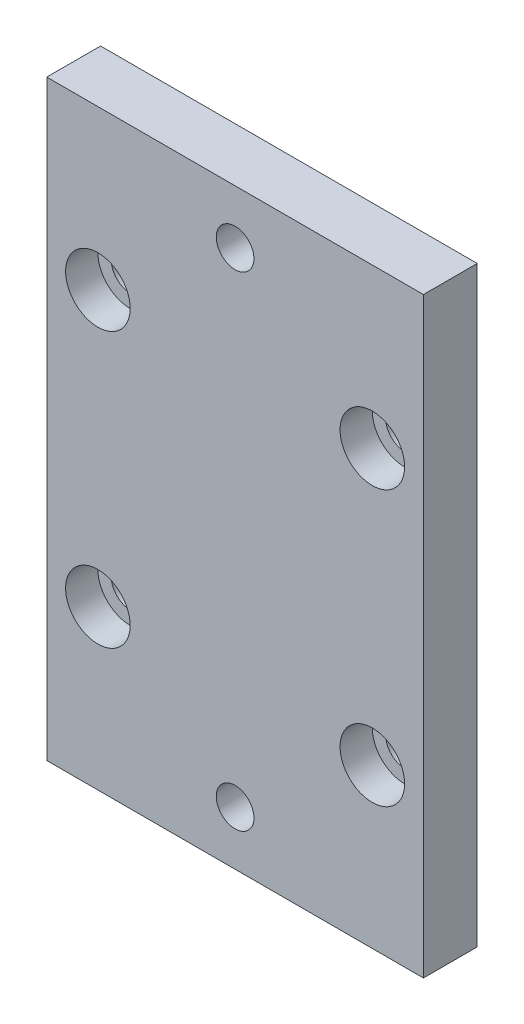
ISO-10303-21;
HEADER;
FILE_DESCRIPTION(('STEP AP214'),'2;1');
FILE_NAME('part.step','',(''),(''),'','','');
FILE_SCHEMA(('AUTOMOTIVE_DESIGN { 1 0 10303 214 1 1 1 1 }'));
ENDSEC;
DATA;
#1=APPLICATION_CONTEXT('core data for automotive mechanical design processes');
#2=APPLICATION_PROTOCOL_DEFINITION('international standard','automotive_design',2000,#1);
#3=PRODUCT_CONTEXT('',#1,'mechanical');
#4=PRODUCT('Part','Part','',(#3));
#5=PRODUCT_RELATED_PRODUCT_CATEGORY('part','',(#4));
#6=PRODUCT_DEFINITION_FORMATION('','',#4);
#7=PRODUCT_DEFINITION_CONTEXT('part definition',#1,'design');
#8=PRODUCT_DEFINITION('design','',#6,#7);
#9=PRODUCT_DEFINITION_SHAPE('','',#8);
#10=(LENGTH_UNIT() NAMED_UNIT(*) SI_UNIT(.MILLI.,.METRE.));
#11=(NAMED_UNIT(*) PLANE_ANGLE_UNIT() SI_UNIT($,.RADIAN.));
#12=(NAMED_UNIT(*) SI_UNIT($,.STERADIAN.) SOLID_ANGLE_UNIT());
#13=UNCERTAINTY_MEASURE_WITH_UNIT(LENGTH_MEASURE(1.E-05),#10,'distance_accuracy_value','');
#14=(GEOMETRIC_REPRESENTATION_CONTEXT(3) GLOBAL_UNCERTAINTY_ASSIGNED_CONTEXT((#13)) GLOBAL_UNIT_ASSIGNED_CONTEXT((#10,
#11,#12)) REPRESENTATION_CONTEXT('',''));
#15=CARTESIAN_POINT('',(0.,0.,0.));
#16=DIRECTION('',(0.,0.,1.));
#17=DIRECTION('',(1.,0.,0.));
#18=AXIS2_PLACEMENT_3D('',#15,#16,#17);
#19=CARTESIAN_POINT('',(4.75,40.25,5.));
#20=DIRECTION('',(0.,0.,-1.));
#21=DIRECTION('',(-1.,0.,0.));
#22=AXIS2_PLACEMENT_3D('',#19,#20,#21);
#23=CYLINDRICAL_SURFACE('',#22,1.75);
#24=CARTESIAN_POINT('',(4.75,40.25,0.));
#25=DIRECTION('',(0.,0.,1.));
#26=DIRECTION('',(1.,0.,0.));
#27=AXIS2_PLACEMENT_3D('',#24,#25,#26);
#28=CIRCLE('',#27,1.75);
#29=CARTESIAN_POINT('',(6.5,40.25,0.));
#30=VERTEX_POINT('',#29);
#31=EDGE_CURVE('E114',#30,#30,#28,.T.);
#32=ORIENTED_EDGE('',*,*,#31,.F.);
#33=EDGE_LOOP('',(#32));
#34=FACE_BOUND('',#33,.T.);
#35=CARTESIAN_POINT('',(4.75,40.25,2.));
#36=DIRECTION('',(0.,0.,1.));
#37=DIRECTION('',(1.,0.,0.));
#38=AXIS2_PLACEMENT_3D('',#35,#36,#37);
#39=CIRCLE('',#38,1.75);
#40=CARTESIAN_POINT('',(6.5,40.25,2.));
#41=VERTEX_POINT('',#40);
#42=EDGE_CURVE('E132',#41,#41,#39,.T.);
#43=ORIENTED_EDGE('',*,*,#42,.T.);
#44=EDGE_LOOP('',(#43));
#45=FACE_BOUND('',#44,.T.);
#46=ADVANCED_FACE('F41',(#34,#45),#23,.F.);
#47=CARTESIAN_POINT('',(30.25,40.25,5.));
#48=DIRECTION('',(0.,0.,-1.));
#49=DIRECTION('',(-1.,0.,0.));
#50=AXIS2_PLACEMENT_3D('',#47,#48,#49);
#51=CYLINDRICAL_SURFACE('',#50,1.75);
#52=CARTESIAN_POINT('',(30.25,40.25,0.));
#53=DIRECTION('',(0.,0.,1.));
#54=DIRECTION('',(1.,0.,0.));
#55=AXIS2_PLACEMENT_3D('',#52,#53,#54);
#56=CIRCLE('',#55,1.75);
#57=CARTESIAN_POINT('',(32.,40.25,0.));
#58=VERTEX_POINT('',#57);
#59=EDGE_CURVE('E166',#58,#58,#56,.T.);
#60=ORIENTED_EDGE('',*,*,#59,.F.);
#61=EDGE_LOOP('',(#60));
#62=FACE_BOUND('',#61,.T.);
#63=CARTESIAN_POINT('',(30.25,40.25,2.));
#64=DIRECTION('',(0.,0.,1.));
#65=DIRECTION('',(1.,0.,0.));
#66=AXIS2_PLACEMENT_3D('',#63,#64,#65);
#67=CIRCLE('',#66,1.75);
#68=CARTESIAN_POINT('',(32.,40.25,2.));
#69=VERTEX_POINT('',#68);
#70=EDGE_CURVE('E129',#69,#69,#67,.T.);
#71=ORIENTED_EDGE('',*,*,#70,.T.);
#72=EDGE_LOOP('',(#71));
#73=FACE_BOUND('',#72,.T.);
#74=ADVANCED_FACE('F240',(#62,#73),#51,.F.);
#75=CARTESIAN_POINT('',(30.25,14.75,5.));
#76=DIRECTION('',(0.,0.,-1.));
#77=DIRECTION('',(-1.,0.,0.));
#78=AXIS2_PLACEMENT_3D('',#75,#76,#77);
#79=CYLINDRICAL_SURFACE('',#78,1.75);
#80=CARTESIAN_POINT('',(30.25,14.75,0.));
#81=DIRECTION('',(0.,0.,1.));
#82=DIRECTION('',(1.,0.,0.));
#83=AXIS2_PLACEMENT_3D('',#80,#81,#82);
#84=CIRCLE('',#83,1.75);
#85=CARTESIAN_POINT('',(32.,14.75,0.));
#86=VERTEX_POINT('',#85);
#87=EDGE_CURVE('E174',#86,#86,#84,.T.);
#88=ORIENTED_EDGE('',*,*,#87,.F.);
#89=EDGE_LOOP('',(#88));
#90=FACE_BOUND('',#89,.T.);
#91=CARTESIAN_POINT('',(30.25,14.75,2.));
#92=DIRECTION('',(0.,0.,1.));
#93=DIRECTION('',(1.,0.,0.));
#94=AXIS2_PLACEMENT_3D('',#91,#92,#93);
#95=CIRCLE('',#94,1.75);
#96=CARTESIAN_POINT('',(32.,14.75,2.));
#97=VERTEX_POINT('',#96);
#98=EDGE_CURVE('E125',#97,#97,#95,.T.);
#99=ORIENTED_EDGE('',*,*,#98,.T.);
#100=EDGE_LOOP('',(#99));
#101=FACE_BOUND('',#100,.T.);
#102=ADVANCED_FACE('F247',(#90,#101),#79,.F.);
#103=CARTESIAN_POINT('',(4.75,14.75,5.));
#104=DIRECTION('',(0.,0.,-1.));
#105=DIRECTION('',(-1.,0.,0.));
#106=AXIS2_PLACEMENT_3D('',#103,#104,#105);
#107=CYLINDRICAL_SURFACE('',#106,1.75);
#108=CARTESIAN_POINT('',(4.75,14.75,0.));
#109=DIRECTION('',(0.,0.,1.));
#110=DIRECTION('',(1.,0.,0.));
#111=AXIS2_PLACEMENT_3D('',#108,#109,#110);
#112=CIRCLE('',#111,1.75);
#113=CARTESIAN_POINT('',(6.5,14.75,0.));
#114=VERTEX_POINT('',#113);
#115=EDGE_CURVE('E162',#114,#114,#112,.T.);
#116=ORIENTED_EDGE('',*,*,#115,.F.);
#117=EDGE_LOOP('',(#116));
#118=FACE_BOUND('',#117,.T.);
#119=CARTESIAN_POINT('',(4.75,14.75,2.));
#120=DIRECTION('',(0.,0.,1.));
#121=DIRECTION('',(1.,0.,0.));
#122=AXIS2_PLACEMENT_3D('',#119,#120,#121);
#123=CIRCLE('',#122,1.75);
#124=CARTESIAN_POINT('',(6.5,14.75,2.));
#125=VERTEX_POINT('',#124);
#126=EDGE_CURVE('E122',#125,#125,#123,.T.);
#127=ORIENTED_EDGE('',*,*,#126,.T.);
#128=EDGE_LOOP('',(#127));
#129=FACE_BOUND('',#128,.T.);
#130=ADVANCED_FACE('F189',(#118,#129),#107,.F.);
#131=CARTESIAN_POINT('',(0.,0.,5.));
#132=DIRECTION('',(0.,0.,-1.));
#133=DIRECTION('',(-1.,0.,0.));
#134=AXIS2_PLACEMENT_3D('',#131,#132,#133);
#135=PLANE('',#134);
#136=CARTESIAN_POINT('',(4.75,14.75,5.));
#137=DIRECTION('',(0.,0.,1.));
#138=DIRECTION('',(1.,0.,0.));
#139=AXIS2_PLACEMENT_3D('',#136,#137,#138);
#140=CIRCLE('',#139,3.);
#141=CARTESIAN_POINT('',(7.75,14.75,5.));
#142=VERTEX_POINT('',#141);
#143=EDGE_CURVE('E204',#142,#142,#140,.T.);
#144=ORIENTED_EDGE('',*,*,#143,.F.);
#145=EDGE_LOOP('',(#144));
#146=FACE_BOUND('',#145,.T.);
#147=CARTESIAN_POINT('',(30.25,14.75,5.));
#148=DIRECTION('',(0.,0.,1.));
#149=DIRECTION('',(1.,0.,0.));
#150=AXIS2_PLACEMENT_3D('',#147,#148,#149);
#151=CIRCLE('',#150,3.);
#152=CARTESIAN_POINT('',(33.25,14.75,5.));
#153=VERTEX_POINT('',#152);
#154=EDGE_CURVE('E210',#153,#153,#151,.T.);
#155=ORIENTED_EDGE('',*,*,#154,.F.);
#156=EDGE_LOOP('',(#155));
#157=FACE_BOUND('',#156,.T.);
#158=CARTESIAN_POINT('',(30.25,40.25,5.));
#159=DIRECTION('',(0.,0.,1.));
#160=DIRECTION('',(1.,0.,0.));
#161=AXIS2_PLACEMENT_3D('',#158,#159,#160);
#162=CIRCLE('',#161,3.);
#163=CARTESIAN_POINT('',(33.25,40.25,5.));
#164=VERTEX_POINT('',#163);
#165=EDGE_CURVE('E198',#164,#164,#162,.T.);
#166=ORIENTED_EDGE('',*,*,#165,.F.);
#167=EDGE_LOOP('',(#166));
#168=FACE_BOUND('',#167,.T.);
#169=CARTESIAN_POINT('',(4.75,40.25,5.));
#170=DIRECTION('',(0.,0.,1.));
#171=DIRECTION('',(1.,0.,0.));
#172=AXIS2_PLACEMENT_3D('',#169,#170,#171);
#173=CIRCLE('',#172,3.);
#174=CARTESIAN_POINT('',(7.75,40.25,5.));
#175=VERTEX_POINT('',#174);
#176=EDGE_CURVE('E195',#175,#175,#173,.T.);
#177=ORIENTED_EDGE('',*,*,#176,.F.);
#178=EDGE_LOOP('',(#177));
#179=FACE_BOUND('',#178,.T.);
#180=DIRECTION('',(0.,-1.,0.));
#181=VECTOR('',#180,1.);
#182=CARTESIAN_POINT('',(0.,0.,5.));
#183=LINE('',#182,#181);
#184=CARTESIAN_POINT('',(0.,55.,5.));
#185=VERTEX_POINT('',#184);
#186=CARTESIAN_POINT('',(0.,0.,5.));
#187=VERTEX_POINT('',#186);
#188=EDGE_CURVE('E96',#185,#187,#183,.T.);
#189=ORIENTED_EDGE('',*,*,#188,.T.);
#190=DIRECTION('',(1.,0.,0.));
#191=VECTOR('',#190,1.);
#192=CARTESIAN_POINT('',(0.,0.,5.));
#193=LINE('',#192,#191);
#194=CARTESIAN_POINT('',(35.,0.,5.));
#195=VERTEX_POINT('',#194);
#196=EDGE_CURVE('E90',#187,#195,#193,.T.);
#197=ORIENTED_EDGE('',*,*,#196,.T.);
#198=DIRECTION('',(0.,1.,0.));
#199=VECTOR('',#198,1.);
#200=CARTESIAN_POINT('',(35.,0.,5.));
#201=LINE('',#200,#199);
#202=CARTESIAN_POINT('',(35.,55.,5.));
#203=VERTEX_POINT('',#202);
#204=EDGE_CURVE('E94',#195,#203,#201,.T.);
#205=ORIENTED_EDGE('',*,*,#204,.T.);
#206=DIRECTION('',(-1.,0.,0.));
#207=VECTOR('',#206,1.);
#208=CARTESIAN_POINT('',(0.,55.,5.));
#209=LINE('',#208,#207);
#210=EDGE_CURVE('E59',#203,#185,#209,.T.);
#211=ORIENTED_EDGE('',*,*,#210,.T.);
#212=EDGE_LOOP('',(#189,#197,#205,#211));
#213=FACE_BOUND('',#212,.T.);
#214=CARTESIAN_POINT('',(17.5,50.,5.));
#215=DIRECTION('',(0.,0.,1.));
#216=DIRECTION('',(1.,0.,0.));
#217=AXIS2_PLACEMENT_3D('',#214,#215,#216);
#218=CIRCLE('',#217,1.75);
#219=CARTESIAN_POINT('',(19.25,50.,5.));
#220=VERTEX_POINT('',#219);
#221=EDGE_CURVE('E177',#220,#220,#218,.T.);
#222=ORIENTED_EDGE('',*,*,#221,.F.);
#223=EDGE_LOOP('',(#222));
#224=FACE_BOUND('',#223,.T.);
#225=CARTESIAN_POINT('',(17.5,5.,5.));
#226=DIRECTION('',(0.,0.,1.));
#227=DIRECTION('',(1.,0.,0.));
#228=AXIS2_PLACEMENT_3D('',#225,#226,#227);
#229=CIRCLE('',#228,1.75);
#230=CARTESIAN_POINT('',(19.25,5.,5.));
#231=VERTEX_POINT('',#230);
#232=EDGE_CURVE('E135',#231,#231,#229,.T.);
#233=ORIENTED_EDGE('',*,*,#232,.F.);
#234=EDGE_LOOP('',(#233));
#235=FACE_BOUND('',#234,.T.);
#236=ADVANCED_FACE('F91',(#146,#157,#168,#179,#213,#224,#235),#135,.F.);
#237=CARTESIAN_POINT('',(0.,0.,0.));
#238=DIRECTION('',(0.,0.,-1.));
#239=DIRECTION('',(-1.,0.,0.));
#240=AXIS2_PLACEMENT_3D('',#237,#238,#239);
#241=PLANE('',#240);
#242=CARTESIAN_POINT('',(17.5,5.,0.));
#243=DIRECTION('',(0.,0.,-1.));
#244=DIRECTION('',(-1.,0.,0.));
#245=AXIS2_PLACEMENT_3D('',#242,#243,#244);
#246=CIRCLE('',#245,3.75000000000001);
#247=CARTESIAN_POINT('',(13.75,5.,0.));
#248=VERTEX_POINT('',#247);
#249=EDGE_CURVE('E138',#248,#248,#246,.F.);
#250=ORIENTED_EDGE('',*,*,#249,.T.);
#251=EDGE_LOOP('',(#250));
#252=FACE_BOUND('',#251,.T.);
#253=CARTESIAN_POINT('',(17.5,50.,0.));
#254=DIRECTION('',(0.,0.,-1.));
#255=DIRECTION('',(-1.,0.,0.));
#256=AXIS2_PLACEMENT_3D('',#253,#254,#255);
#257=CIRCLE('',#256,3.75000000000001);
#258=CARTESIAN_POINT('',(13.75,50.,0.));
#259=VERTEX_POINT('',#258);
#260=EDGE_CURVE('E121',#259,#259,#257,.F.);
#261=ORIENTED_EDGE('',*,*,#260,.T.);
#262=EDGE_LOOP('',(#261));
#263=FACE_BOUND('',#262,.T.);
#264=ORIENTED_EDGE('',*,*,#115,.T.);
#265=EDGE_LOOP('',(#264));
#266=FACE_BOUND('',#265,.T.);
#267=ORIENTED_EDGE('',*,*,#59,.T.);
#268=EDGE_LOOP('',(#267));
#269=FACE_BOUND('',#268,.T.);
#270=ORIENTED_EDGE('',*,*,#31,.T.);
#271=EDGE_LOOP('',(#270));
#272=FACE_BOUND('',#271,.T.);
#273=DIRECTION('',(0.,-1.,0.));
#274=VECTOR('',#273,1.);
#275=CARTESIAN_POINT('',(0.,0.,0.));
#276=LINE('',#275,#274);
#277=CARTESIAN_POINT('',(0.,55.,0.));
#278=VERTEX_POINT('',#277);
#279=CARTESIAN_POINT('',(0.,0.,0.));
#280=VERTEX_POINT('',#279);
#281=EDGE_CURVE('E111',#278,#280,#276,.T.);
#282=ORIENTED_EDGE('',*,*,#281,.F.);
#283=DIRECTION('',(-1.,0.,0.));
#284=VECTOR('',#283,1.);
#285=CARTESIAN_POINT('',(0.,55.,0.));
#286=LINE('',#285,#284);
#287=CARTESIAN_POINT('',(35.,55.,0.));
#288=VERTEX_POINT('',#287);
#289=EDGE_CURVE('E82',#288,#278,#286,.T.);
#290=ORIENTED_EDGE('',*,*,#289,.F.);
#291=DIRECTION('',(0.,1.,0.));
#292=VECTOR('',#291,1.);
#293=CARTESIAN_POINT('',(35.,0.,0.));
#294=LINE('',#293,#292);
#295=CARTESIAN_POINT('',(35.,0.,0.));
#296=VERTEX_POINT('',#295);
#297=EDGE_CURVE('E76',#296,#288,#294,.T.);
#298=ORIENTED_EDGE('',*,*,#297,.F.);
#299=DIRECTION('',(1.,0.,0.));
#300=VECTOR('',#299,1.);
#301=CARTESIAN_POINT('',(0.,0.,0.));
#302=LINE('',#301,#300);
#303=EDGE_CURVE('E101',#280,#296,#302,.T.);
#304=ORIENTED_EDGE('',*,*,#303,.F.);
#305=EDGE_LOOP('',(#282,#290,#298,#304));
#306=FACE_BOUND('',#305,.T.);
#307=ORIENTED_EDGE('',*,*,#87,.T.);
#308=EDGE_LOOP('',(#307));
#309=FACE_BOUND('',#308,.T.);
#310=ADVANCED_FACE('F152',(#252,#263,#266,#269,#272,#306,#309),#241,.T.);
#311=CARTESIAN_POINT('',(0.,0.,5.));
#312=DIRECTION('',(1.,0.,0.));
#313=DIRECTION('',(0.,0.,-1.));
#314=AXIS2_PLACEMENT_3D('',#311,#312,#313);
#315=PLANE('',#314);
#316=ORIENTED_EDGE('',*,*,#281,.T.);
#317=DIRECTION('',(0.,0.,-1.));
#318=VECTOR('',#317,1.);
#319=CARTESIAN_POINT('',(0.,0.,5.));
#320=LINE('',#319,#318);
#321=EDGE_CURVE('E102',#187,#280,#320,.T.);
#322=ORIENTED_EDGE('',*,*,#321,.F.);
#323=ORIENTED_EDGE('',*,*,#188,.F.);
#324=DIRECTION('',(0.,0.,-1.));
#325=VECTOR('',#324,1.);
#326=CARTESIAN_POINT('',(0.,55.,5.));
#327=LINE('',#326,#325);
#328=EDGE_CURVE('E107',#185,#278,#327,.T.);
#329=ORIENTED_EDGE('',*,*,#328,.T.);
#330=EDGE_LOOP('',(#316,#322,#323,#329));
#331=FACE_BOUND('',#330,.T.);
#332=ADVANCED_FACE('F155',(#331),#315,.F.);
#333=CARTESIAN_POINT('',(0.,0.,5.));
#334=DIRECTION('',(0.,1.,0.));
#335=DIRECTION('',(0.,0.,1.));
#336=AXIS2_PLACEMENT_3D('',#333,#334,#335);
#337=PLANE('',#336);
#338=ORIENTED_EDGE('',*,*,#303,.T.);
#339=DIRECTION('',(0.,0.,-1.));
#340=VECTOR('',#339,1.);
#341=CARTESIAN_POINT('',(35.,0.,5.));
#342=LINE('',#341,#340);
#343=EDGE_CURVE('E99',#195,#296,#342,.T.);
#344=ORIENTED_EDGE('',*,*,#343,.F.);
#345=ORIENTED_EDGE('',*,*,#196,.F.);
#346=ORIENTED_EDGE('',*,*,#321,.T.);
#347=EDGE_LOOP('',(#338,#344,#345,#346));
#348=FACE_BOUND('',#347,.T.);
#349=ADVANCED_FACE('F100',(#348),#337,.F.);
#350=CARTESIAN_POINT('',(35.,0.,5.));
#351=DIRECTION('',(-1.,0.,0.));
#352=DIRECTION('',(0.,0.,1.));
#353=AXIS2_PLACEMENT_3D('',#350,#351,#352);
#354=PLANE('',#353);
#355=ORIENTED_EDGE('',*,*,#297,.T.);
#356=DIRECTION('',(0.,0.,-1.));
#357=VECTOR('',#356,1.);
#358=CARTESIAN_POINT('',(35.,55.,5.));
#359=LINE('',#358,#357);
#360=EDGE_CURVE('E103',#203,#288,#359,.T.);
#361=ORIENTED_EDGE('',*,*,#360,.F.);
#362=ORIENTED_EDGE('',*,*,#204,.F.);
#363=ORIENTED_EDGE('',*,*,#343,.T.);
#364=EDGE_LOOP('',(#355,#361,#362,#363));
#365=FACE_BOUND('',#364,.T.);
#366=ADVANCED_FACE('F105',(#365),#354,.F.);
#367=CARTESIAN_POINT('',(0.,55.,5.));
#368=DIRECTION('',(0.,-1.,0.));
#369=DIRECTION('',(0.,0.,-1.));
#370=AXIS2_PLACEMENT_3D('',#367,#368,#369);
#371=PLANE('',#370);
#372=ORIENTED_EDGE('',*,*,#289,.T.);
#373=ORIENTED_EDGE('',*,*,#328,.F.);
#374=ORIENTED_EDGE('',*,*,#210,.F.);
#375=ORIENTED_EDGE('',*,*,#360,.T.);
#376=EDGE_LOOP('',(#372,#373,#374,#375));
#377=FACE_BOUND('',#376,.T.);
#378=ADVANCED_FACE('F253',(#377),#371,.F.);
#379=CARTESIAN_POINT('',(17.5,50.,5.));
#380=DIRECTION('',(0.,0.,-1.));
#381=DIRECTION('',(-1.,0.,0.));
#382=AXIS2_PLACEMENT_3D('',#379,#380,#381);
#383=CYLINDRICAL_SURFACE('',#382,1.75);
#384=CARTESIAN_POINT('',(17.5,50.,2.00000000000002));
#385=DIRECTION('',(0.,0.,-1.));
#386=DIRECTION('',(-1.,0.,0.));
#387=AXIS2_PLACEMENT_3D('',#384,#385,#386);
#388=CIRCLE('',#387,1.75);
#389=CARTESIAN_POINT('',(15.75,50.,2.00000000000002));
#390=VERTEX_POINT('',#389);
#391=EDGE_CURVE('E11',#390,#390,#388,.T.);
#392=ORIENTED_EDGE('',*,*,#391,.T.);
#393=EDGE_LOOP('',(#392));
#394=FACE_BOUND('',#393,.T.);
#395=ORIENTED_EDGE('',*,*,#221,.T.);
#396=EDGE_LOOP('',(#395));
#397=FACE_BOUND('',#396,.T.);
#398=ADVANCED_FACE('F186',(#394,#397),#383,.F.);
#399=CARTESIAN_POINT('',(17.5,5.,5.));
#400=DIRECTION('',(0.,0.,-1.));
#401=DIRECTION('',(-1.,0.,0.));
#402=AXIS2_PLACEMENT_3D('',#399,#400,#401);
#403=CYLINDRICAL_SURFACE('',#402,1.75);
#404=CARTESIAN_POINT('',(17.5,5.,2.00000000000002));
#405=DIRECTION('',(0.,0.,-1.));
#406=DIRECTION('',(-1.,0.,0.));
#407=AXIS2_PLACEMENT_3D('',#404,#405,#406);
#408=CIRCLE('',#407,1.75);
#409=CARTESIAN_POINT('',(15.75,5.,2.00000000000002));
#410=VERTEX_POINT('',#409);
#411=EDGE_CURVE('E51',#410,#410,#408,.T.);
#412=ORIENTED_EDGE('',*,*,#411,.T.);
#413=EDGE_LOOP('',(#412));
#414=FACE_BOUND('',#413,.T.);
#415=ORIENTED_EDGE('',*,*,#232,.T.);
#416=EDGE_LOOP('',(#415));
#417=FACE_BOUND('',#416,.T.);
#418=ADVANCED_FACE('F143',(#414,#417),#403,.F.);
#419=CARTESIAN_POINT('',(4.75,14.75,2.));
#420=DIRECTION('',(0.,0.,1.));
#421=DIRECTION('',(1.,0.,0.));
#422=AXIS2_PLACEMENT_3D('',#419,#420,#421);
#423=CYLINDRICAL_SURFACE('',#422,3.);
#424=CARTESIAN_POINT('',(4.75,14.75,2.));
#425=DIRECTION('',(0.,0.,1.));
#426=DIRECTION('',(1.,0.,0.));
#427=AXIS2_PLACEMENT_3D('',#424,#425,#426);
#428=CIRCLE('',#427,3.);
#429=CARTESIAN_POINT('',(7.75,14.75,2.));
#430=VERTEX_POINT('',#429);
#431=EDGE_CURVE('E201',#430,#430,#428,.T.);
#432=ORIENTED_EDGE('',*,*,#431,.F.);
#433=EDGE_LOOP('',(#432));
#434=FACE_BOUND('',#433,.T.);
#435=ORIENTED_EDGE('',*,*,#143,.T.);
#436=EDGE_LOOP('',(#435));
#437=FACE_BOUND('',#436,.T.);
#438=ADVANCED_FACE('F302',(#434,#437),#423,.F.);
#439=CARTESIAN_POINT('',(4.75,14.75,2.));
#440=DIRECTION('',(0.,0.,1.));
#441=DIRECTION('',(1.,0.,0.));
#442=AXIS2_PLACEMENT_3D('',#439,#440,#441);
#443=PLANE('',#442);
#444=ORIENTED_EDGE('',*,*,#126,.F.);
#445=EDGE_LOOP('',(#444));
#446=FACE_BOUND('',#445,.T.);
#447=ORIENTED_EDGE('',*,*,#431,.T.);
#448=EDGE_LOOP('',(#447));
#449=FACE_BOUND('',#448,.T.);
#450=ADVANCED_FACE('F334',(#446,#449),#443,.T.);
#451=CARTESIAN_POINT('',(30.25,14.75,2.));
#452=DIRECTION('',(0.,0.,1.));
#453=DIRECTION('',(1.,0.,0.));
#454=AXIS2_PLACEMENT_3D('',#451,#452,#453);
#455=CYLINDRICAL_SURFACE('',#454,3.);
#456=CARTESIAN_POINT('',(30.25,14.75,2.));
#457=DIRECTION('',(0.,0.,1.));
#458=DIRECTION('',(1.,0.,0.));
#459=AXIS2_PLACEMENT_3D('',#456,#457,#458);
#460=CIRCLE('',#459,3.);
#461=CARTESIAN_POINT('',(33.25,14.75,2.));
#462=VERTEX_POINT('',#461);
#463=EDGE_CURVE('E207',#462,#462,#460,.T.);
#464=ORIENTED_EDGE('',*,*,#463,.F.);
#465=EDGE_LOOP('',(#464));
#466=FACE_BOUND('',#465,.T.);
#467=ORIENTED_EDGE('',*,*,#154,.T.);
#468=EDGE_LOOP('',(#467));
#469=FACE_BOUND('',#468,.T.);
#470=ADVANCED_FACE('F344',(#466,#469),#455,.F.);
#471=CARTESIAN_POINT('',(30.25,14.75,2.));
#472=DIRECTION('',(0.,0.,1.));
#473=DIRECTION('',(1.,0.,0.));
#474=AXIS2_PLACEMENT_3D('',#471,#472,#473);
#475=PLANE('',#474);
#476=ORIENTED_EDGE('',*,*,#98,.F.);
#477=EDGE_LOOP('',(#476));
#478=FACE_BOUND('',#477,.T.);
#479=ORIENTED_EDGE('',*,*,#463,.T.);
#480=EDGE_LOOP('',(#479));
#481=FACE_BOUND('',#480,.T.);
#482=ADVANCED_FACE('F354',(#478,#481),#475,.T.);
#483=CARTESIAN_POINT('',(30.25,40.25,2.));
#484=DIRECTION('',(0.,0.,1.));
#485=DIRECTION('',(1.,0.,0.));
#486=AXIS2_PLACEMENT_3D('',#483,#484,#485);
#487=CYLINDRICAL_SURFACE('',#486,3.);
#488=CARTESIAN_POINT('',(30.25,40.25,2.));
#489=DIRECTION('',(0.,0.,1.));
#490=DIRECTION('',(1.,0.,0.));
#491=AXIS2_PLACEMENT_3D('',#488,#489,#490);
#492=CIRCLE('',#491,3.);
#493=CARTESIAN_POINT('',(33.25,40.25,2.));
#494=VERTEX_POINT('',#493);
#495=EDGE_CURVE('E213',#494,#494,#492,.T.);
#496=ORIENTED_EDGE('',*,*,#495,.F.);
#497=EDGE_LOOP('',(#496));
#498=FACE_BOUND('',#497,.T.);
#499=ORIENTED_EDGE('',*,*,#165,.T.);
#500=EDGE_LOOP('',(#499));
#501=FACE_BOUND('',#500,.T.);
#502=ADVANCED_FACE('F219',(#498,#501),#487,.F.);
#503=CARTESIAN_POINT('',(30.25,40.25,2.));
#504=DIRECTION('',(0.,0.,1.));
#505=DIRECTION('',(1.,0.,0.));
#506=AXIS2_PLACEMENT_3D('',#503,#504,#505);
#507=PLANE('',#506);
#508=ORIENTED_EDGE('',*,*,#70,.F.);
#509=EDGE_LOOP('',(#508));
#510=FACE_BOUND('',#509,.T.);
#511=ORIENTED_EDGE('',*,*,#495,.T.);
#512=EDGE_LOOP('',(#511));
#513=FACE_BOUND('',#512,.T.);
#514=ADVANCED_FACE('F226',(#510,#513),#507,.T.);
#515=CARTESIAN_POINT('',(4.75,40.25,2.));
#516=DIRECTION('',(0.,0.,1.));
#517=DIRECTION('',(1.,0.,0.));
#518=AXIS2_PLACEMENT_3D('',#515,#516,#517);
#519=CYLINDRICAL_SURFACE('',#518,3.);
#520=CARTESIAN_POINT('',(4.75,40.25,2.));
#521=DIRECTION('',(0.,0.,1.));
#522=DIRECTION('',(1.,0.,0.));
#523=AXIS2_PLACEMENT_3D('',#520,#521,#522);
#524=CIRCLE('',#523,3.);
#525=CARTESIAN_POINT('',(7.75,40.25,2.));
#526=VERTEX_POINT('',#525);
#527=EDGE_CURVE('E126',#526,#526,#524,.T.);
#528=ORIENTED_EDGE('',*,*,#527,.F.);
#529=EDGE_LOOP('',(#528));
#530=FACE_BOUND('',#529,.T.);
#531=ORIENTED_EDGE('',*,*,#176,.T.);
#532=EDGE_LOOP('',(#531));
#533=FACE_BOUND('',#532,.T.);
#534=ADVANCED_FACE('F224',(#530,#533),#519,.F.);
#535=CARTESIAN_POINT('',(4.75,40.25,2.));
#536=DIRECTION('',(0.,0.,1.));
#537=DIRECTION('',(1.,0.,0.));
#538=AXIS2_PLACEMENT_3D('',#535,#536,#537);
#539=PLANE('',#538);
#540=ORIENTED_EDGE('',*,*,#42,.F.);
#541=EDGE_LOOP('',(#540));
#542=FACE_BOUND('',#541,.T.);
#543=ORIENTED_EDGE('',*,*,#527,.T.);
#544=EDGE_LOOP('',(#543));
#545=FACE_BOUND('',#544,.T.);
#546=ADVANCED_FACE('F149',(#542,#545),#539,.T.);
#547=CARTESIAN_POINT('',(17.5,5.,0.));
#548=DIRECTION('',(0.,0.,-1.));
#549=DIRECTION('',(-1.,0.,0.));
#550=AXIS2_PLACEMENT_3D('',#547,#548,#549);
#551=CONICAL_SURFACE('',#550,3.75000000000001,0.785398163397446);
#552=ORIENTED_EDGE('',*,*,#411,.F.);
#553=EDGE_LOOP('',(#552));
#554=FACE_BOUND('',#553,.T.);
#555=ORIENTED_EDGE('',*,*,#249,.F.);
#556=EDGE_LOOP('',(#555));
#557=FACE_BOUND('',#556,.T.);
#558=ADVANCED_FACE('F146',(#554,#557),#551,.F.);
#559=CARTESIAN_POINT('',(17.5,50.,0.));
#560=DIRECTION('',(0.,0.,-1.));
#561=DIRECTION('',(-1.,0.,0.));
#562=AXIS2_PLACEMENT_3D('',#559,#560,#561);
#563=CONICAL_SURFACE('',#562,3.75000000000001,0.785398163397446);
#564=ORIENTED_EDGE('',*,*,#391,.F.);
#565=EDGE_LOOP('',(#564));
#566=FACE_BOUND('',#565,.T.);
#567=ORIENTED_EDGE('',*,*,#260,.F.);
#568=EDGE_LOOP('',(#567));
#569=FACE_BOUND('',#568,.T.);
#570=ADVANCED_FACE('F44',(#566,#569),#563,.F.);
#571=CLOSED_SHELL('',(#46,#74,#102,#130,#236,#310,#332,#349,#366,#378,#398,#418,#438,#450,#470,
#482,#502,#514,#534,#546,#558,#570));
#572=MANIFOLD_SOLID_BREP('B2',#571);
#573=ADVANCED_BREP_SHAPE_REPRESENTATION('',(#18,#572),#14);
#574=SHAPE_DEFINITION_REPRESENTATION(#9,#573);
ENDSEC;
END-ISO-10303-21;
